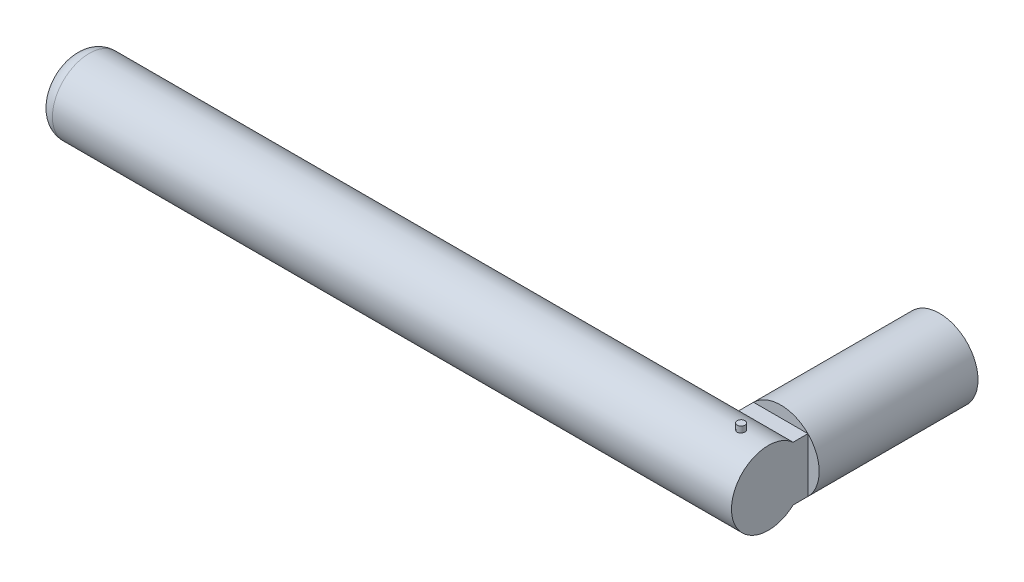
ISO-10303-21;
HEADER;
FILE_DESCRIPTION(('STEP AP214'),'2;1');
FILE_NAME('part.step','',(''),(''),'','','');
FILE_SCHEMA(('AUTOMOTIVE_DESIGN { 1 0 10303 214 1 1 1 1 }'));
ENDSEC;
DATA;
#1=APPLICATION_CONTEXT('core data for automotive mechanical design processes');
#2=APPLICATION_PROTOCOL_DEFINITION('international standard','automotive_design',2000,#1);
#3=PRODUCT_CONTEXT('',#1,'mechanical');
#4=PRODUCT('Part','Part','',(#3));
#5=PRODUCT_RELATED_PRODUCT_CATEGORY('part','',(#4));
#6=PRODUCT_DEFINITION_FORMATION('','',#4);
#7=PRODUCT_DEFINITION_CONTEXT('part definition',#1,'design');
#8=PRODUCT_DEFINITION('design','',#6,#7);
#9=PRODUCT_DEFINITION_SHAPE('','',#8);
#10=(LENGTH_UNIT() NAMED_UNIT(*) SI_UNIT(.MILLI.,.METRE.));
#11=(NAMED_UNIT(*) PLANE_ANGLE_UNIT() SI_UNIT($,.RADIAN.));
#12=(NAMED_UNIT(*) SI_UNIT($,.STERADIAN.) SOLID_ANGLE_UNIT());
#13=UNCERTAINTY_MEASURE_WITH_UNIT(LENGTH_MEASURE(1.E-05),#10,'distance_accuracy_value','');
#14=(GEOMETRIC_REPRESENTATION_CONTEXT(3) GLOBAL_UNCERTAINTY_ASSIGNED_CONTEXT((#13)) GLOBAL_UNIT_ASSIGNED_CONTEXT((#10,
#11,#12)) REPRESENTATION_CONTEXT('',''));
#15=CARTESIAN_POINT('',(0.,0.,0.));
#16=DIRECTION('',(0.,0.,1.));
#17=DIRECTION('',(1.,0.,0.));
#18=AXIS2_PLACEMENT_3D('',#15,#16,#17);
#19=CARTESIAN_POINT('',(0.,0.,0.));
#20=DIRECTION('',(0.,0.,1.));
#21=DIRECTION('',(1.,0.,0.));
#22=AXIS2_PLACEMENT_3D('',#19,#20,#21);
#23=PLANE('',#22);
#24=CARTESIAN_POINT('',(0.,0.,0.));
#25=DIRECTION('',(0.,0.,1.));
#26=DIRECTION('',(1.,0.,0.));
#27=AXIS2_PLACEMENT_3D('',#24,#25,#26);
#28=CIRCLE('',#27,4.95);
#29=CARTESIAN_POINT('',(-3.50017856687341,3.50017856687341,0.));
#30=VERTEX_POINT('',#29);
#31=CARTESIAN_POINT('',(-3.50017856687341,-3.50017856687341,0.));
#32=VERTEX_POINT('',#31);
#33=EDGE_CURVE('E111',#30,#32,#28,.T.);
#34=ORIENTED_EDGE('',*,*,#33,.T.);
#35=DIRECTION('',(0.,1.,0.));
#36=VECTOR('',#35,1.);
#37=CARTESIAN_POINT('',(-3.50017856687341,0.,0.));
#38=LINE('',#37,#36);
#39=EDGE_CURVE('E124',#32,#30,#38,.T.);
#40=ORIENTED_EDGE('',*,*,#39,.T.);
#41=EDGE_LOOP('',(#34,#40));
#42=FACE_BOUND('',#41,.T.);
#43=ADVANCED_FACE('F47',(#42),#23,.T.);
#44=CARTESIAN_POINT('',(3.50017856687341,3.50017856687341,0.));
#45=VERTEX_POINT('',#44);
#46=EDGE_CURVE('E104',#45,#30,#28,.T.);
#47=ORIENTED_EDGE('',*,*,#46,.T.);
#48=DIRECTION('',(1.,0.,0.));
#49=VECTOR('',#48,1.);
#50=CARTESIAN_POINT('',(0.,3.50017856687341,0.));
#51=LINE('',#50,#49);
#52=EDGE_CURVE('E92',#30,#45,#51,.T.);
#53=ORIENTED_EDGE('',*,*,#52,.T.);
#54=EDGE_LOOP('',(#47,#53));
#55=FACE_BOUND('',#54,.T.);
#56=ADVANCED_FACE('F122',(#55),#23,.T.);
#57=DIRECTION('',(1.,0.,0.));
#58=VECTOR('',#57,1.);
#59=CARTESIAN_POINT('',(0.,-3.50017856687341,0.));
#60=LINE('',#59,#58);
#61=CARTESIAN_POINT('',(3.50017856687341,-3.50017856687341,0.));
#62=VERTEX_POINT('',#61);
#63=EDGE_CURVE('E128',#32,#62,#60,.T.);
#64=ORIENTED_EDGE('',*,*,#63,.F.);
#65=EDGE_CURVE('E121',#32,#62,#28,.T.);
#66=ORIENTED_EDGE('',*,*,#65,.T.);
#67=EDGE_LOOP('',(#64,#66));
#68=FACE_BOUND('',#67,.T.);
#69=ADVANCED_FACE('F191',(#68),#23,.T.);
#70=CARTESIAN_POINT('',(0.,0.,-20.44));
#71=DIRECTION('',(0.,0.,1.));
#72=DIRECTION('',(1.,0.,0.));
#73=AXIS2_PLACEMENT_3D('',#70,#71,#72);
#74=CYLINDRICAL_SURFACE('',#73,4.95);
#75=CARTESIAN_POINT('',(0.,0.,-20.44));
#76=DIRECTION('',(0.,0.,1.));
#77=DIRECTION('',(1.,0.,0.));
#78=AXIS2_PLACEMENT_3D('',#75,#76,#77);
#79=CIRCLE('',#78,4.95);
#80=CARTESIAN_POINT('',(4.95,0.,-20.44));
#81=VERTEX_POINT('',#80);
#82=EDGE_CURVE('E114',#81,#81,#79,.T.);
#83=ORIENTED_EDGE('',*,*,#82,.T.);
#84=EDGE_LOOP('',(#83));
#85=FACE_BOUND('',#84,.T.);
#86=ORIENTED_EDGE('',*,*,#46,.F.);
#87=EDGE_CURVE('E108',#62,#45,#28,.T.);
#88=ORIENTED_EDGE('',*,*,#87,.F.);
#89=ORIENTED_EDGE('',*,*,#65,.F.);
#90=ORIENTED_EDGE('',*,*,#33,.F.);
#91=EDGE_LOOP('',(#86,#88,#89,#90));
#92=FACE_BOUND('',#91,.T.);
#93=ADVANCED_FACE('F106',(#85,#92),#74,.T.);
#94=CARTESIAN_POINT('',(0.,0.,-20.44));
#95=DIRECTION('',(0.,0.,1.));
#96=DIRECTION('',(1.,0.,0.));
#97=AXIS2_PLACEMENT_3D('',#94,#95,#96);
#98=PLANE('',#97);
#99=ORIENTED_EDGE('',*,*,#82,.F.);
#100=EDGE_LOOP('',(#99));
#101=FACE_BOUND('',#100,.T.);
#102=ADVANCED_FACE('F195',(#101),#98,.F.);
#103=DIRECTION('',(0.,1.,0.));
#104=VECTOR('',#103,1.);
#105=CARTESIAN_POINT('',(3.50017856687341,0.,0.));
#106=LINE('',#105,#104);
#107=EDGE_CURVE('E119',#62,#45,#106,.T.);
#108=ORIENTED_EDGE('',*,*,#107,.F.);
#109=ORIENTED_EDGE('',*,*,#87,.T.);
#110=EDGE_LOOP('',(#108,#109));
#111=FACE_BOUND('',#110,.T.);
#112=ADVANCED_FACE('F118',(#111),#23,.T.);
#113=CARTESIAN_POINT('',(0.,-3.50017856687341,5.1));
#114=DIRECTION('',(0.,1.,0.));
#115=DIRECTION('',(0.,0.,1.));
#116=AXIS2_PLACEMENT_3D('',#113,#114,#115);
#117=PLANE('',#116);
#118=DIRECTION('',(0.,0.,-1.));
#119=VECTOR('',#118,1.);
#120=CARTESIAN_POINT('',(3.50017856687341,-3.50017856687341,5.1));
#121=LINE('',#120,#119);
#122=CARTESIAN_POINT('',(3.50017856687341,-3.50017856687341,1.91111696671076));
#123=VERTEX_POINT('',#122);
#124=EDGE_CURVE('E63',#123,#62,#121,.T.);
#125=ORIENTED_EDGE('',*,*,#124,.F.);
#126=DIRECTION('',(-1.,0.,0.));
#127=VECTOR('',#126,1.);
#128=CARTESIAN_POINT('',(16.8927810025466,-3.50017856687341,1.91111696671076));
#129=LINE('',#128,#127);
#130=CARTESIAN_POINT('',(-3.50017856687341,-3.50017856687341,1.91111696671076));
#131=VERTEX_POINT('',#130);
#132=EDGE_CURVE('E219',#123,#131,#129,.T.);
#133=ORIENTED_EDGE('',*,*,#132,.T.);
#134=DIRECTION('',(0.,0.,-1.));
#135=VECTOR('',#134,1.);
#136=CARTESIAN_POINT('',(-3.50017856687341,-3.50017856687341,5.1));
#137=LINE('',#136,#135);
#138=EDGE_CURVE('E138',#131,#32,#137,.T.);
#139=ORIENTED_EDGE('',*,*,#138,.T.);
#140=ORIENTED_EDGE('',*,*,#63,.T.);
#141=EDGE_LOOP('',(#125,#133,#139,#140));
#142=FACE_BOUND('',#141,.T.);
#143=ADVANCED_FACE('F194',(#142),#117,.F.);
#144=CARTESIAN_POINT('',(3.50017856687341,0.,5.1));
#145=DIRECTION('',(-1.,0.,0.));
#146=DIRECTION('',(0.,0.,1.));
#147=AXIS2_PLACEMENT_3D('',#144,#145,#146);
#148=PLANE('',#147);
#149=CARTESIAN_POINT('',(3.50017856687341,0.,5.1));
#150=DIRECTION('',(-1.,0.,0.));
#151=DIRECTION('',(0.,0.,1.));
#152=AXIS2_PLACEMENT_3D('',#149,#150,#151);
#153=CIRCLE('',#152,4.735);
#154=CARTESIAN_POINT('',(3.50017856687341,3.50017856687341,1.91111696671076));
#155=VERTEX_POINT('',#154);
#156=EDGE_CURVE('E217',#155,#123,#153,.F.);
#157=ORIENTED_EDGE('',*,*,#156,.T.);
#158=ORIENTED_EDGE('',*,*,#124,.T.);
#159=ORIENTED_EDGE('',*,*,#107,.T.);
#160=DIRECTION('',(0.,0.,-1.));
#161=VECTOR('',#160,1.);
#162=CARTESIAN_POINT('',(3.50017856687341,3.50017856687341,5.1));
#163=LINE('',#162,#161);
#164=EDGE_CURVE('E88',#155,#45,#163,.T.);
#165=ORIENTED_EDGE('',*,*,#164,.F.);
#166=EDGE_LOOP('',(#157,#158,#159,#165));
#167=FACE_BOUND('',#166,.T.);
#168=ADVANCED_FACE('F126',(#167),#148,.F.);
#169=CARTESIAN_POINT('',(0.,3.50017856687341,5.1));
#170=DIRECTION('',(0.,1.,0.));
#171=DIRECTION('',(0.,0.,1.));
#172=AXIS2_PLACEMENT_3D('',#169,#170,#171);
#173=PLANE('',#172);
#174=DIRECTION('',(-1.,0.,0.));
#175=VECTOR('',#174,1.);
#176=CARTESIAN_POINT('',(16.8927810025466,3.50017856687341,1.91111696671076));
#177=LINE('',#176,#175);
#178=CARTESIAN_POINT('',(-3.50017856687341,3.50017856687341,1.91111696671076));
#179=VERTEX_POINT('',#178);
#180=EDGE_CURVE('E71',#155,#179,#177,.T.);
#181=ORIENTED_EDGE('',*,*,#180,.F.);
#182=ORIENTED_EDGE('',*,*,#164,.T.);
#183=ORIENTED_EDGE('',*,*,#52,.F.);
#184=DIRECTION('',(0.,0.,-1.));
#185=VECTOR('',#184,1.);
#186=CARTESIAN_POINT('',(-3.50017856687341,3.50017856687341,5.1));
#187=LINE('',#186,#185);
#188=EDGE_CURVE('E98',#179,#30,#187,.T.);
#189=ORIENTED_EDGE('',*,*,#188,.F.);
#190=EDGE_LOOP('',(#181,#182,#183,#189));
#191=FACE_BOUND('',#190,.T.);
#192=ADVANCED_FACE('F90',(#191),#173,.T.);
#193=CARTESIAN_POINT('',(-3.50017856687341,0.,5.1));
#194=DIRECTION('',(-1.,0.,0.));
#195=DIRECTION('',(0.,0.,1.));
#196=AXIS2_PLACEMENT_3D('',#193,#194,#195);
#197=PLANE('',#196);
#198=CARTESIAN_POINT('',(-3.50017856687341,0.,5.1));
#199=DIRECTION('',(-1.,0.,0.));
#200=DIRECTION('',(0.,0.,1.));
#201=AXIS2_PLACEMENT_3D('',#198,#199,#200);
#202=CIRCLE('',#201,4.735);
#203=EDGE_CURVE('E215',#179,#131,#202,.T.);
#204=ORIENTED_EDGE('',*,*,#203,.F.);
#205=ORIENTED_EDGE('',*,*,#188,.T.);
#206=ORIENTED_EDGE('',*,*,#39,.F.);
#207=ORIENTED_EDGE('',*,*,#138,.F.);
#208=EDGE_LOOP('',(#204,#205,#206,#207));
#209=FACE_BOUND('',#208,.T.);
#210=ADVANCED_FACE('F170',(#209),#197,.T.);
#211=CARTESIAN_POINT('',(16.8927810025466,0.,5.1));
#212=DIRECTION('',(-1.,0.,0.));
#213=DIRECTION('',(0.,0.,1.));
#214=AXIS2_PLACEMENT_3D('',#211,#212,#213);
#215=CYLINDRICAL_SURFACE('',#214,4.735);
#216=CARTESIAN_POINT('',(-83.9001785668734,0.,5.1));
#217=DIRECTION('',(-1.,0.,0.));
#218=DIRECTION('',(0.,0.,1.));
#219=AXIS2_PLACEMENT_3D('',#216,#217,#218);
#220=CIRCLE('',#219,4.735);
#221=CARTESIAN_POINT('',(-83.9001785668734,0.,9.835));
#222=VERTEX_POINT('',#221);
#223=EDGE_CURVE('E12',#222,#222,#220,.F.);
#224=ORIENTED_EDGE('',*,*,#223,.T.);
#225=EDGE_LOOP('',(#224));
#226=FACE_BOUND('',#225,.T.);
#227=CARTESIAN_POINT('',(0.,-4.70852683968139,4.6));
#228=CARTESIAN_POINT('',(-0.0280010885634094,-4.70852718509327,4.60000120871144));
#229=CARTESIAN_POINT('',(-0.0560204844999844,-4.70877931173512,4.60236010796753));
#230=CARTESIAN_POINT('',(-0.111281828558603,-4.70976038755327,4.61173424809595));
#231=CARTESIAN_POINT('',(-0.13852289516618,-4.71048985662464,4.61875456605145));
#232=CARTESIAN_POINT('',(-0.191419346818075,-4.7123420893989,4.63724431232591));
#233=CARTESIAN_POINT('',(-0.217075705215805,-4.71346460880029,4.64871097748045));
#234=CARTESIAN_POINT('',(-0.26609432241684,-4.71597616338109,4.67576248130844));
#235=CARTESIAN_POINT('',(-0.289457022614889,-4.71736514712914,4.6913465254887));
#236=CARTESIAN_POINT('',(-0.333324850132392,-4.72025940827438,4.72625795513208));
#237=CARTESIAN_POINT('',(-0.353819404911534,-4.72176508571256,4.74559859364884));
#238=CARTESIAN_POINT('',(-0.391278073234624,-4.72471945894748,4.78744582457387));
#239=CARTESIAN_POINT('',(-0.40824202243199,-4.72616815208912,4.80995256427969));
#240=CARTESIAN_POINT('',(-0.438194813497397,-4.72884931548438,4.85755829319887));
#241=CARTESIAN_POINT('',(-0.451174247224167,-4.73008127110133,4.88266323331976));
#242=CARTESIAN_POINT('',(-0.472729367409836,-4.73218578755494,4.93471147887361));
#243=CARTESIAN_POINT('',(-0.481305172647464,-4.73305835808514,4.96165473469961));
#244=CARTESIAN_POINT('',(-0.493778451759961,-4.73434297897094,5.01650762966047));
#245=CARTESIAN_POINT('',(-0.497693344747283,-4.73475674360988,5.04441326698966));
#246=CARTESIAN_POINT('',(-0.5007875856327,-4.73508296825135,5.10048835127441));
#247=CARTESIAN_POINT('',(-0.499967069347191,-4.73499544263141,5.12865779064071));
#248=CARTESIAN_POINT('',(-0.493627886109753,-4.73433034822261,5.18434254857614));
#249=CARTESIAN_POINT('',(-0.488127950474299,-4.73375473324475,5.21186002612858));
#250=CARTESIAN_POINT('',(-0.472615252957399,-4.73218037656064,5.26557915109913));
#251=CARTESIAN_POINT('',(-0.462602426720348,-4.73118162882037,5.29178077974679));
#252=CARTESIAN_POINT('',(-0.438327764528071,-4.72886991499813,5.34218326663212));
#253=CARTESIAN_POINT('',(-0.42405767721807,-4.72755633970363,5.36638012180782));
#254=CARTESIAN_POINT('',(-0.391679561605633,-4.72476227760851,5.4120425240143));
#255=CARTESIAN_POINT('',(-0.373571407711316,-4.72328178534665,5.43350798162959));
#256=CARTESIAN_POINT('',(-0.333925925444582,-4.72031141196499,5.47320804473085));
#257=CARTESIAN_POINT('',(-0.312372296175698,-4.7188215202811,5.491426374841));
#258=CARTESIAN_POINT('',(-0.266504101298866,-4.71600745984698,5.52398892820825));
#259=CARTESIAN_POINT('',(-0.242189530891075,-4.71468329138486,5.53833314473014));
#260=CARTESIAN_POINT('',(-0.191476740025446,-4.71235051755479,5.56274041802731));
#261=CARTESIAN_POINT('',(-0.165078002522251,-4.71134199080201,5.57280240847577));
#262=CARTESIAN_POINT('',(-0.110952697389449,-4.70975629700784,5.58834641075592));
#263=CARTESIAN_POINT('',(-0.0832261750137505,-4.70917911527633,5.59382857856103));
#264=CARTESIAN_POINT('',(-0.0273754108739286,-4.70852403841295,5.60003625503052));
#265=CARTESIAN_POINT('',(0.000746270136702533,-4.70844375043162,5.60078456054474));
#266=CARTESIAN_POINT('',(0.0567146163882495,-4.70878523451841,5.59756319776412));
#267=CARTESIAN_POINT('',(0.0845612857748448,-4.70920699900662,5.59359360069939));
#268=CARTESIAN_POINT('',(0.139122313441617,-4.71050288775884,5.58106821326338));
#269=CARTESIAN_POINT('',(0.165839186002375,-4.71137594341145,5.57252325517329));
#270=CARTESIAN_POINT('',(0.217460482824596,-4.71347517674352,5.55110078299361));
#271=CARTESIAN_POINT('',(0.242364860939647,-4.71470136340981,5.53822315864053));
#272=CARTESIAN_POINT('',(0.289757976917506,-4.7173744791684,5.50844401130672));
#273=CARTESIAN_POINT('',(0.312237195910646,-4.7188222277375,5.49152741388546));
#274=CARTESIAN_POINT('',(0.354045241409957,-4.7217726839601,5.45417206561037));
#275=CARTESIAN_POINT('',(0.37337398084754,-4.72327539313112,5.43373321744556));
#276=CARTESIAN_POINT('',(0.408411310717447,-4.72617370351035,5.38981451152528));
#277=CARTESIAN_POINT('',(0.424105007163157,-4.72756884895638,5.36632273740131));
#278=CARTESIAN_POINT('',(0.451324159187992,-4.7300881666889,5.3170236960218));
#279=CARTESIAN_POINT('',(0.462849677550101,-4.73121234305677,5.29121646365005));
#280=CARTESIAN_POINT('',(0.481380200532527,-4.73306100805642,5.23807055482556));
#281=CARTESIAN_POINT('',(0.488394121033487,-4.73378628458551,5.21073501562121));
#282=CARTESIAN_POINT('',(0.497731429147664,-4.73475867231155,5.15526618703541));
#283=CARTESIAN_POINT('',(0.500054964837872,-4.73500579860384,5.12713292286683));
#284=CARTESIAN_POINT('',(0.499943326210347,-4.73499402091009,5.07101335659937));
#285=CARTESIAN_POINT('',(0.497531240786454,-4.73473757214281,5.04302700520082));
#286=CARTESIAN_POINT('',(0.488065345667881,-4.73375230910351,4.98785951582828));
#287=CARTESIAN_POINT('',(0.481011533531561,-4.73302349458302,4.96067837827786));
#288=CARTESIAN_POINT('',(0.462468995786991,-4.73117512489876,4.90789366453256));
#289=CARTESIAN_POINT('',(0.450981036671163,-4.73005563727046,4.88228981657187));
#290=CARTESIAN_POINT('',(0.423898738509025,-4.7275505409003,4.83337003541162));
#291=CARTESIAN_POINT('',(0.408304408325541,-4.72616493273281,4.81005409727418));
#292=CARTESIAN_POINT('',(0.373365636442535,-4.72327463055074,4.76625370426256));
#293=CARTESIAN_POINT('',(0.354003993424752,-4.72176940978779,4.7457830049317));
#294=CARTESIAN_POINT('',(0.312114679088892,-4.71881394540906,4.70837122406548));
#295=CARTESIAN_POINT('',(0.289586251415208,-4.71736371503257,4.69143098815353));
#296=CARTESIAN_POINT('',(0.241932834072944,-4.71467808599516,4.66152269103984));
#297=CARTESIAN_POINT('',(0.216800740679394,-4.71344330113309,4.64856590116032));
#298=CARTESIAN_POINT('',(0.164720179386719,-4.71133564659894,4.62707389283431));
#299=CARTESIAN_POINT('',(0.137773783752031,-4.71046237190355,4.61853372347143));
#300=CARTESIAN_POINT('',(0.0922311422449748,-4.70939517889303,4.60822976360874));
#301=CARTESIAN_POINT('',(0.0739253281346136,-4.70907110810143,4.6051478643266));
#302=CARTESIAN_POINT('',(0.037082352082013,-4.70863682462791,4.60103258719744));
#303=CARTESIAN_POINT('',(0.0185451912563393,-4.70852661091423,4.59999919946738));
#304=CARTESIAN_POINT('',(0.,-4.70852683968139,4.6));
#305=B_SPLINE_CURVE_WITH_KNOTS('',3,(#227,#228,#229,#230,#231,#232,#233,#234,#235,#236,#237,
#238,#239,#240,#241,#242,#243,#244,#245,#246,#247,#248,#249,#250,#251,#252,#253,#254,#255,#256,
#257,#258,#259,#260,#261,#262,#263,#264,#265,#266,#267,#268,#269,#270,#271,#272,#273,#274,#275,
#276,#277,#278,#279,#280,#281,#282,#283,#284,#285,#286,#287,#288,#289,#290,#291,#292,#293,#294,
#295,#296,#297,#298,#299,#300,#301,#302,#303,#304),.UNSPECIFIED.,.T.,.F.,(4,2,2,2,2,2,2,2,2,2,2,
2,2,2,2,2,2,2,2,2,2,2,2,2,2,2,2,2,2,2,2,2,2,2,2,2,2,2,4),(0.,0.0839355370804653,
0.167962644623715,0.251937617333886,0.335896397976888,0.420156944549075,0.50442141249873,
0.588883339917629,0.673342989031852,0.757485988284053,0.841626574240692,0.925431928708409,
1.00923847831145,1.09320852751834,1.17718132487584,1.26156385164717,1.34594652511816,
1.43035019863312,1.51475099752462,1.5987450363008,1.68273780696512,1.76653259626013,
1.8503295182387,1.93444421922575,2.01856124446435,2.10301705792207,2.18747159921516,
2.27175872332815,2.35604318642728,2.4399177343932,2.52379232647883,2.60765242638175,
2.69151234528993,2.77576455061428,2.86003691305482,2.94454557837261,3.02895930521527,
3.08455029035516,3.14014100729589),.UNSPECIFIED.);
#306=CARTESIAN_POINT('',(0.,-4.70852683968139,4.6));
#307=VERTEX_POINT('',#306);
#308=EDGE_CURVE('E147',#307,#307,#305,.T.);
#309=ORIENTED_EDGE('',*,*,#308,.T.);
#310=EDGE_LOOP('',(#309));
#311=FACE_BOUND('',#310,.T.);
#312=CARTESIAN_POINT('',(0.,4.70852683968139,4.6));
#313=CARTESIAN_POINT('',(0.0280010885634111,4.70852718509327,4.60000120871144));
#314=CARTESIAN_POINT('',(0.0560204844999861,4.70877931173512,4.60236010796753));
#315=CARTESIAN_POINT('',(0.111281828558605,4.70976038755326,4.61173424809595));
#316=CARTESIAN_POINT('',(0.138522895166181,4.71048985662464,4.61875456605145));
#317=CARTESIAN_POINT('',(0.191419346818077,4.71234208939889,4.63724431232591));
#318=CARTESIAN_POINT('',(0.217075705215808,4.71346460880029,4.64871097748045));
#319=CARTESIAN_POINT('',(0.266094322416842,4.71597616338109,4.67576248130844));
#320=CARTESIAN_POINT('',(0.289457022614891,4.71736514712914,4.6913465254887));
#321=CARTESIAN_POINT('',(0.333324850132394,4.72025940827438,4.72625795513208));
#322=CARTESIAN_POINT('',(0.353819404911536,4.72176508571255,4.74559859364884));
#323=CARTESIAN_POINT('',(0.391278073234626,4.72471945894748,4.78744582457387));
#324=CARTESIAN_POINT('',(0.408242022431992,4.72616815208912,4.80995256427969));
#325=CARTESIAN_POINT('',(0.438194813497399,4.72884931548438,4.85755829319887));
#326=CARTESIAN_POINT('',(0.451174247224168,4.73008127110133,4.88266323331976));
#327=CARTESIAN_POINT('',(0.472729367409838,4.73218578755494,4.93471147887361));
#328=CARTESIAN_POINT('',(0.481305172647466,4.73305835808513,4.96165473469961));
#329=CARTESIAN_POINT('',(0.493778451759962,4.73434297897093,5.01650762966047));
#330=CARTESIAN_POINT('',(0.497693344747285,4.73475674360987,5.04441326698966));
#331=CARTESIAN_POINT('',(0.500787585632702,4.73508296825135,5.10048835127441));
#332=CARTESIAN_POINT('',(0.499967069347193,4.73499544263141,5.12865779064071));
#333=CARTESIAN_POINT('',(0.493627886109755,4.73433034822261,5.18434254857614));
#334=CARTESIAN_POINT('',(0.4881279504743,4.73375473324475,5.21186002612858));
#335=CARTESIAN_POINT('',(0.472615252957401,4.73218037656064,5.26557915109913));
#336=CARTESIAN_POINT('',(0.46260242672035,4.73118162882037,5.29178077974679));
#337=CARTESIAN_POINT('',(0.438327764528073,4.72886991499812,5.34218326663212));
#338=CARTESIAN_POINT('',(0.424057677218072,4.72755633970362,5.36638012180782));
#339=CARTESIAN_POINT('',(0.391679561605635,4.7247622776085,5.4120425240143));
#340=CARTESIAN_POINT('',(0.373571407711318,4.72328178534665,5.43350798162959));
#341=CARTESIAN_POINT('',(0.333925925444584,4.72031141196499,5.47320804473085));
#342=CARTESIAN_POINT('',(0.3123722961757,4.7188215202811,5.491426374841));
#343=CARTESIAN_POINT('',(0.266504101298868,4.71600745984698,5.52398892820825));
#344=CARTESIAN_POINT('',(0.242189530891077,4.71468329138486,5.53833314473014));
#345=CARTESIAN_POINT('',(0.191476740025448,4.71235051755479,5.56274041802731));
#346=CARTESIAN_POINT('',(0.165078002522253,4.71134199080201,5.57280240847577));
#347=CARTESIAN_POINT('',(0.11095269738945,4.70975629700783,5.58834641075592));
#348=CARTESIAN_POINT('',(0.0832261750137522,4.70917911527633,5.59382857856103));
#349=CARTESIAN_POINT('',(0.0273754108739303,4.70852403841295,5.60003625503052));
#350=CARTESIAN_POINT('',(-0.000746270136700799,4.70844375043162,5.60078456054474));
#351=CARTESIAN_POINT('',(-0.0567146163882478,4.70878523451841,5.59756319776412));
#352=CARTESIAN_POINT('',(-0.0845612857748431,4.70920699900662,5.59359360069939));
#353=CARTESIAN_POINT('',(-0.139122313441616,4.71050288775884,5.58106821326338));
#354=CARTESIAN_POINT('',(-0.165839186002374,4.71137594341145,5.57252325517329));
#355=CARTESIAN_POINT('',(-0.217460482824594,4.71347517674352,5.55110078299361));
#356=CARTESIAN_POINT('',(-0.242364860939645,4.71470136340981,5.53822315864053));
#357=CARTESIAN_POINT('',(-0.289757976917505,4.7173744791684,5.50844401130672));
#358=CARTESIAN_POINT('',(-0.312237195910644,4.71882222773749,5.49152741388546));
#359=CARTESIAN_POINT('',(-0.354045241409955,4.7217726839601,5.45417206561037));
#360=CARTESIAN_POINT('',(-0.373373980847538,4.72327539313112,5.43373321744556));
#361=CARTESIAN_POINT('',(-0.408411310717445,4.72617370351035,5.38981451152528));
#362=CARTESIAN_POINT('',(-0.424105007163155,4.72756884895638,5.36632273740131));
#363=CARTESIAN_POINT('',(-0.451324159187991,4.7300881666889,5.3170236960218));
#364=CARTESIAN_POINT('',(-0.462849677550099,4.73121234305676,5.29121646365005));
#365=CARTESIAN_POINT('',(-0.481380200532525,4.73306100805642,5.23807055482556));
#366=CARTESIAN_POINT('',(-0.488394121033485,4.73378628458551,5.21073501562121));
#367=CARTESIAN_POINT('',(-0.497731429147662,4.73475867231155,5.15526618703541));
#368=CARTESIAN_POINT('',(-0.50005496483787,4.73500579860384,5.12713292286683));
#369=CARTESIAN_POINT('',(-0.499943326210345,4.73499402091009,5.07101335659937));
#370=CARTESIAN_POINT('',(-0.497531240786452,4.73473757214281,5.04302700520082));
#371=CARTESIAN_POINT('',(-0.488065345667879,4.73375230910351,4.98785951582828));
#372=CARTESIAN_POINT('',(-0.481011533531559,4.73302349458302,4.96067837827786));
#373=CARTESIAN_POINT('',(-0.462468995786989,4.73117512489876,4.90789366453256));
#374=CARTESIAN_POINT('',(-0.450981036671162,4.73005563727046,4.88228981657187));
#375=CARTESIAN_POINT('',(-0.423898738509023,4.7275505409003,4.83337003541162));
#376=CARTESIAN_POINT('',(-0.408304408325539,4.72616493273281,4.81005409727418));
#377=CARTESIAN_POINT('',(-0.373365636442534,4.72327463055074,4.76625370426256));
#378=CARTESIAN_POINT('',(-0.35400399342475,4.72176940978779,4.7457830049317));
#379=CARTESIAN_POINT('',(-0.312114679088891,4.71881394540906,4.70837122406548));
#380=CARTESIAN_POINT('',(-0.289586251415206,4.71736371503256,4.69143098815353));
#381=CARTESIAN_POINT('',(-0.241932834072942,4.71467808599516,4.66152269103984));
#382=CARTESIAN_POINT('',(-0.216800740679393,4.71344330113309,4.64856590116032));
#383=CARTESIAN_POINT('',(-0.164720179386717,4.71133564659894,4.62707389283431));
#384=CARTESIAN_POINT('',(-0.13777378375203,4.71046237190355,4.61853372347143));
#385=CARTESIAN_POINT('',(-0.092231142244973,4.70939517889302,4.60822976360874));
#386=CARTESIAN_POINT('',(-0.0739253281346117,4.70907110810143,4.6051478643266));
#387=CARTESIAN_POINT('',(-0.0370823520820111,4.70863682462791,4.60103258719744));
#388=CARTESIAN_POINT('',(-0.0185451912563375,4.70852661091423,4.59999919946738));
#389=CARTESIAN_POINT('',(0.,4.70852683968139,4.6));
#390=B_SPLINE_CURVE_WITH_KNOTS('',3,(#312,#313,#314,#315,#316,#317,#318,#319,#320,#321,#322,
#323,#324,#325,#326,#327,#328,#329,#330,#331,#332,#333,#334,#335,#336,#337,#338,#339,#340,#341,
#342,#343,#344,#345,#346,#347,#348,#349,#350,#351,#352,#353,#354,#355,#356,#357,#358,#359,#360,
#361,#362,#363,#364,#365,#366,#367,#368,#369,#370,#371,#372,#373,#374,#375,#376,#377,#378,#379,
#380,#381,#382,#383,#384,#385,#386,#387,#388,#389),.UNSPECIFIED.,.T.,.F.,(4,2,2,2,2,2,2,2,2,2,2,
2,2,2,2,2,2,2,2,2,2,2,2,2,2,2,2,2,2,2,2,2,2,2,2,2,2,2,4),(0.,0.0839355370804652,
0.167962644623715,0.251937617333887,0.335896397976888,0.420156944549075,0.50442141249873,
0.58888333991763,0.673342989031852,0.757485988284053,0.841626574240692,0.925431928708409,
1.00923847831145,1.09320852751834,1.17718132487584,1.26156385164717,1.34594652511816,
1.43035019863312,1.51475099752462,1.5987450363008,1.68273780696512,1.76653259626013,
1.8503295182387,1.93444421922575,2.01856124446435,2.10301705792207,2.18747159921516,
2.27175872332815,2.35604318642728,2.4399177343932,2.52379232647883,2.60765242638175,
2.69151234528993,2.77576455061428,2.86003691305482,2.94454557837261,3.02895930521527,
3.08455029035516,3.14014100729589),.UNSPECIFIED.);
#391=CARTESIAN_POINT('',(0.,4.70852683968139,4.6));
#392=VERTEX_POINT('',#391);
#393=EDGE_CURVE('E157',#392,#392,#390,.T.);
#394=ORIENTED_EDGE('',*,*,#393,.T.);
#395=EDGE_LOOP('',(#394));
#396=FACE_BOUND('',#395,.T.);
#397=ORIENTED_EDGE('',*,*,#132,.F.);
#398=ORIENTED_EDGE('',*,*,#156,.F.);
#399=ORIENTED_EDGE('',*,*,#180,.T.);
#400=ORIENTED_EDGE('',*,*,#203,.T.);
#401=EDGE_LOOP('',(#397,#398,#399,#400));
#402=FACE_BOUND('',#401,.T.);
#403=ADVANCED_FACE('F165',(#226,#311,#396,#402),#215,.T.);
#404=CARTESIAN_POINT('',(-85.9001785668734,0.,0.));
#405=DIRECTION('',(-1.,0.,0.));
#406=DIRECTION('',(0.,0.,1.));
#407=AXIS2_PLACEMENT_3D('',#404,#405,#406);
#408=PLANE('',#407);
#409=CARTESIAN_POINT('',(-85.9001785668734,0.,5.1));
#410=DIRECTION('',(-1.,0.,0.));
#411=DIRECTION('',(0.,0.,1.));
#412=AXIS2_PLACEMENT_3D('',#409,#410,#411);
#413=CIRCLE('',#412,2.735);
#414=CARTESIAN_POINT('',(-85.9001785668734,0.,7.835));
#415=VERTEX_POINT('',#414);
#416=EDGE_CURVE('E56',#415,#415,#413,.T.);
#417=ORIENTED_EDGE('',*,*,#416,.T.);
#418=EDGE_LOOP('',(#417));
#419=FACE_BOUND('',#418,.T.);
#420=ADVANCED_FACE('F169',(#419),#408,.T.);
#421=CARTESIAN_POINT('',(0.,-5.50017856687341,0.));
#422=DIRECTION('',(0.,-1.,0.));
#423=DIRECTION('',(0.,0.,-1.));
#424=AXIS2_PLACEMENT_3D('',#421,#422,#423);
#425=PLANE('',#424);
#426=CARTESIAN_POINT('',(0.,-5.50017856687341,5.1));
#427=DIRECTION('',(0.,-1.,0.));
#428=DIRECTION('',(0.,0.,-1.));
#429=AXIS2_PLACEMENT_3D('',#426,#427,#428);
#430=CIRCLE('',#429,0.5);
#431=CARTESIAN_POINT('',(0.,-5.50017856687341,4.6));
#432=VERTEX_POINT('',#431);
#433=EDGE_CURVE('E223',#432,#432,#430,.T.);
#434=ORIENTED_EDGE('',*,*,#433,.T.);
#435=EDGE_LOOP('',(#434));
#436=FACE_BOUND('',#435,.T.);
#437=ADVANCED_FACE('F172',(#436),#425,.T.);
#438=CARTESIAN_POINT('',(0.,8.91439212924651,5.1));
#439=DIRECTION('',(0.,-1.,0.));
#440=DIRECTION('',(0.,0.,-1.));
#441=AXIS2_PLACEMENT_3D('',#438,#439,#440);
#442=CYLINDRICAL_SURFACE('',#441,0.5);
#443=ORIENTED_EDGE('',*,*,#308,.F.);
#444=EDGE_LOOP('',(#443));
#445=FACE_BOUND('',#444,.T.);
#446=ORIENTED_EDGE('',*,*,#433,.F.);
#447=EDGE_LOOP('',(#446));
#448=FACE_BOUND('',#447,.T.);
#449=ADVANCED_FACE('F161',(#445,#448),#442,.T.);
#450=CARTESIAN_POINT('',(0.,5.50017856687341,5.1));
#451=DIRECTION('',(0.,1.,0.));
#452=DIRECTION('',(0.,0.,1.));
#453=AXIS2_PLACEMENT_3D('',#450,#451,#452);
#454=PLANE('',#453);
#455=CARTESIAN_POINT('',(0.,5.50017856687341,5.1));
#456=DIRECTION('',(0.,1.,0.));
#457=DIRECTION('',(0.,0.,1.));
#458=AXIS2_PLACEMENT_3D('',#455,#456,#457);
#459=CIRCLE('',#458,0.5);
#460=CARTESIAN_POINT('',(0.,5.50017856687341,5.6));
#461=VERTEX_POINT('',#460);
#462=EDGE_CURVE('E131',#461,#461,#459,.F.);
#463=ORIENTED_EDGE('',*,*,#462,.F.);
#464=EDGE_LOOP('',(#463));
#465=FACE_BOUND('',#464,.T.);
#466=ADVANCED_FACE('F180',(#465),#454,.T.);
#467=ORIENTED_EDGE('',*,*,#393,.F.);
#468=EDGE_LOOP('',(#467));
#469=FACE_BOUND('',#468,.T.);
#470=ORIENTED_EDGE('',*,*,#462,.T.);
#471=EDGE_LOOP('',(#470));
#472=FACE_BOUND('',#471,.T.);
#473=ADVANCED_FACE('F182',(#469,#472),#442,.T.);
#474=CARTESIAN_POINT('',(-83.9001785668734,0.,5.1));
#475=DIRECTION('',(-1.,0.,0.));
#476=DIRECTION('',(0.,0.,1.));
#477=AXIS2_PLACEMENT_3D('',#474,#475,#476);
#478=TOROIDAL_SURFACE('',#477,2.735,2.);
#479=ORIENTED_EDGE('',*,*,#223,.F.);
#480=EDGE_LOOP('',(#479));
#481=FACE_BOUND('',#480,.T.);
#482=ORIENTED_EDGE('',*,*,#416,.F.);
#483=EDGE_LOOP('',(#482));
#484=FACE_BOUND('',#483,.T.);
#485=ADVANCED_FACE('F49',(#481,#484),#478,.T.);
#486=CLOSED_SHELL('',(#43,#56,#69,#93,#102,#112,#143,#168,#192,#210,#403,#420,#437,#449,#466,
#473,#485));
#487=MANIFOLD_SOLID_BREP('B2',#486);
#488=ADVANCED_BREP_SHAPE_REPRESENTATION('',(#18,#487),#14);
#489=SHAPE_DEFINITION_REPRESENTATION(#9,#488);
ENDSEC;
END-ISO-10303-21;
